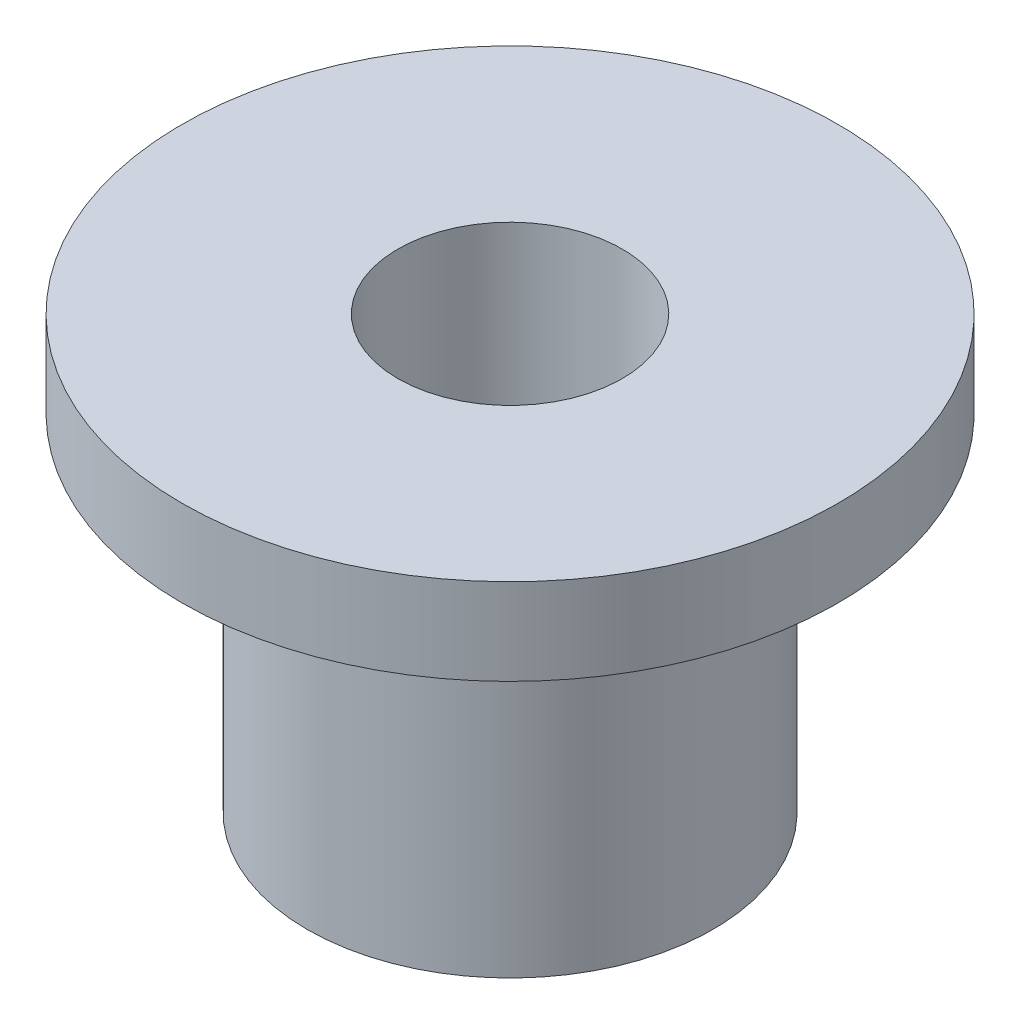
ISO-10303-21;
HEADER;
FILE_DESCRIPTION(('STEP AP214'),'2;1');
FILE_NAME('part.step','',(''),(''),'','','');
FILE_SCHEMA(('AUTOMOTIVE_DESIGN { 1 0 10303 214 1 1 1 1 }'));
ENDSEC;
DATA;
#1=APPLICATION_CONTEXT('core data for automotive mechanical design processes');
#2=APPLICATION_PROTOCOL_DEFINITION('international standard','automotive_design',2000,#1);
#3=PRODUCT_CONTEXT('',#1,'mechanical');
#4=PRODUCT('Part','Part','',(#3));
#5=PRODUCT_RELATED_PRODUCT_CATEGORY('part','',(#4));
#6=PRODUCT_DEFINITION_FORMATION('','',#4);
#7=PRODUCT_DEFINITION_CONTEXT('part definition',#1,'design');
#8=PRODUCT_DEFINITION('design','',#6,#7);
#9=PRODUCT_DEFINITION_SHAPE('','',#8);
#10=(LENGTH_UNIT() NAMED_UNIT(*) SI_UNIT(.MILLI.,.METRE.));
#11=(NAMED_UNIT(*) PLANE_ANGLE_UNIT() SI_UNIT($,.RADIAN.));
#12=(NAMED_UNIT(*) SI_UNIT($,.STERADIAN.) SOLID_ANGLE_UNIT());
#13=UNCERTAINTY_MEASURE_WITH_UNIT(LENGTH_MEASURE(1.E-05),#10,'distance_accuracy_value','');
#14=(GEOMETRIC_REPRESENTATION_CONTEXT(3) GLOBAL_UNCERTAINTY_ASSIGNED_CONTEXT((#13)) GLOBAL_UNIT_ASSIGNED_CONTEXT((#10,
#11,#12)) REPRESENTATION_CONTEXT('',''));
#15=CARTESIAN_POINT('',(0.,0.,0.));
#16=DIRECTION('',(0.,0.,1.));
#17=DIRECTION('',(1.,0.,0.));
#18=AXIS2_PLACEMENT_3D('',#15,#16,#17);
#19=CARTESIAN_POINT('',(-4.7,0.,0.));
#20=DIRECTION('',(0.,-1.,0.));
#21=DIRECTION('',(0.,0.,-1.));
#22=AXIS2_PLACEMENT_3D('',#19,#20,#21);
#23=PLANE('',#22);
#24=CARTESIAN_POINT('',(0.,0.,0.));
#25=DIRECTION('',(0.,1.,0.));
#26=DIRECTION('',(0.,0.,1.));
#27=AXIS2_PLACEMENT_3D('',#24,#25,#26);
#28=CIRCLE('',#27,2.6);
#29=CARTESIAN_POINT('',(0.,0.,2.6));
#30=VERTEX_POINT('',#29);
#31=EDGE_CURVE('E10',#30,#30,#28,.T.);
#32=ORIENTED_EDGE('',*,*,#31,.T.);
#33=EDGE_LOOP('',(#32));
#34=FACE_BOUND('',#33,.T.);
#35=CARTESIAN_POINT('',(0.,0.,0.));
#36=DIRECTION('',(0.,1.,0.));
#37=DIRECTION('',(0.,0.,1.));
#38=AXIS2_PLACEMENT_3D('',#35,#36,#37);
#39=CIRCLE('',#38,4.7);
#40=CARTESIAN_POINT('',(0.,0.,4.7));
#41=VERTEX_POINT('',#40);
#42=EDGE_CURVE('E57',#41,#41,#39,.T.);
#43=ORIENTED_EDGE('',*,*,#42,.F.);
#44=EDGE_LOOP('',(#43));
#45=FACE_BOUND('',#44,.T.);
#46=ADVANCED_FACE('F35',(#34,#45),#23,.T.);
#47=CARTESIAN_POINT('',(0.,5.17341155810984,0.));
#48=DIRECTION('',(0.,1.,0.));
#49=DIRECTION('',(0.,0.,1.));
#50=AXIS2_PLACEMENT_3D('',#47,#48,#49);
#51=CYLINDRICAL_SURFACE('',#50,2.6);
#52=CARTESIAN_POINT('',(0.,10.,0.));
#53=DIRECTION('',(0.,1.,0.));
#54=DIRECTION('',(0.,0.,1.));
#55=AXIS2_PLACEMENT_3D('',#52,#53,#54);
#56=CIRCLE('',#55,2.6);
#57=CARTESIAN_POINT('',(0.,10.,2.6));
#58=VERTEX_POINT('',#57);
#59=EDGE_CURVE('E41',#58,#58,#56,.T.);
#60=ORIENTED_EDGE('',*,*,#59,.T.);
#61=EDGE_LOOP('',(#60));
#62=FACE_BOUND('',#61,.T.);
#63=ORIENTED_EDGE('',*,*,#31,.F.);
#64=EDGE_LOOP('',(#63));
#65=FACE_BOUND('',#64,.T.);
#66=ADVANCED_FACE('F65',(#62,#65),#51,.F.);
#67=CARTESIAN_POINT('',(-2.6,10.,0.));
#68=DIRECTION('',(0.,1.,0.));
#69=DIRECTION('',(0.,0.,1.));
#70=AXIS2_PLACEMENT_3D('',#67,#68,#69);
#71=PLANE('',#70);
#72=CARTESIAN_POINT('',(0.,10.,0.));
#73=DIRECTION('',(0.,1.,0.));
#74=DIRECTION('',(0.,0.,1.));
#75=AXIS2_PLACEMENT_3D('',#72,#73,#74);
#76=CIRCLE('',#75,7.6);
#77=CARTESIAN_POINT('',(0.,10.,7.6));
#78=VERTEX_POINT('',#77);
#79=EDGE_CURVE('E45',#78,#78,#76,.T.);
#80=ORIENTED_EDGE('',*,*,#79,.T.);
#81=EDGE_LOOP('',(#80));
#82=FACE_BOUND('',#81,.T.);
#83=ORIENTED_EDGE('',*,*,#59,.F.);
#84=EDGE_LOOP('',(#83));
#85=FACE_BOUND('',#84,.T.);
#86=ADVANCED_FACE('F69',(#82,#85),#71,.T.);
#87=CARTESIAN_POINT('',(0.,5.17341155810984,0.));
#88=DIRECTION('',(0.,1.,0.));
#89=DIRECTION('',(0.,0.,1.));
#90=AXIS2_PLACEMENT_3D('',#87,#88,#89);
#91=CYLINDRICAL_SURFACE('',#90,7.6);
#92=CARTESIAN_POINT('',(0.,8.,0.));
#93=DIRECTION('',(0.,1.,0.));
#94=DIRECTION('',(0.,0.,1.));
#95=AXIS2_PLACEMENT_3D('',#92,#93,#94);
#96=CIRCLE('',#95,7.6);
#97=CARTESIAN_POINT('',(0.,8.,7.6));
#98=VERTEX_POINT('',#97);
#99=EDGE_CURVE('E49',#98,#98,#96,.T.);
#100=ORIENTED_EDGE('',*,*,#99,.T.);
#101=EDGE_LOOP('',(#100));
#102=FACE_BOUND('',#101,.T.);
#103=ORIENTED_EDGE('',*,*,#79,.F.);
#104=EDGE_LOOP('',(#103));
#105=FACE_BOUND('',#104,.T.);
#106=ADVANCED_FACE('F73',(#102,#105),#91,.T.);
#107=CARTESIAN_POINT('',(-7.6,8.,0.));
#108=DIRECTION('',(0.,-1.,0.));
#109=DIRECTION('',(0.,0.,-1.));
#110=AXIS2_PLACEMENT_3D('',#107,#108,#109);
#111=PLANE('',#110);
#112=CARTESIAN_POINT('',(0.,8.,0.));
#113=DIRECTION('',(0.,1.,0.));
#114=DIRECTION('',(0.,0.,1.));
#115=AXIS2_PLACEMENT_3D('',#112,#113,#114);
#116=CIRCLE('',#115,4.7);
#117=CARTESIAN_POINT('',(0.,8.,4.7));
#118=VERTEX_POINT('',#117);
#119=EDGE_CURVE('E54',#118,#118,#116,.T.);
#120=ORIENTED_EDGE('',*,*,#119,.T.);
#121=EDGE_LOOP('',(#120));
#122=FACE_BOUND('',#121,.T.);
#123=ORIENTED_EDGE('',*,*,#99,.F.);
#124=EDGE_LOOP('',(#123));
#125=FACE_BOUND('',#124,.T.);
#126=ADVANCED_FACE('F80',(#122,#125),#111,.T.);
#127=CARTESIAN_POINT('',(0.,5.17341155810984,0.));
#128=DIRECTION('',(0.,1.,0.));
#129=DIRECTION('',(0.,0.,1.));
#130=AXIS2_PLACEMENT_3D('',#127,#128,#129);
#131=CYLINDRICAL_SURFACE('',#130,4.7);
#132=ORIENTED_EDGE('',*,*,#42,.T.);
#133=EDGE_LOOP('',(#132));
#134=FACE_BOUND('',#133,.T.);
#135=ORIENTED_EDGE('',*,*,#119,.F.);
#136=EDGE_LOOP('',(#135));
#137=FACE_BOUND('',#136,.T.);
#138=ADVANCED_FACE('F61',(#134,#137),#131,.T.);
#139=CLOSED_SHELL('',(#46,#66,#86,#106,#126,#138));
#140=MANIFOLD_SOLID_BREP('B2',#139);
#141=ADVANCED_BREP_SHAPE_REPRESENTATION('',(#18,#140),#14);
#142=SHAPE_DEFINITION_REPRESENTATION(#9,#141);
ENDSEC;
END-ISO-10303-21;
